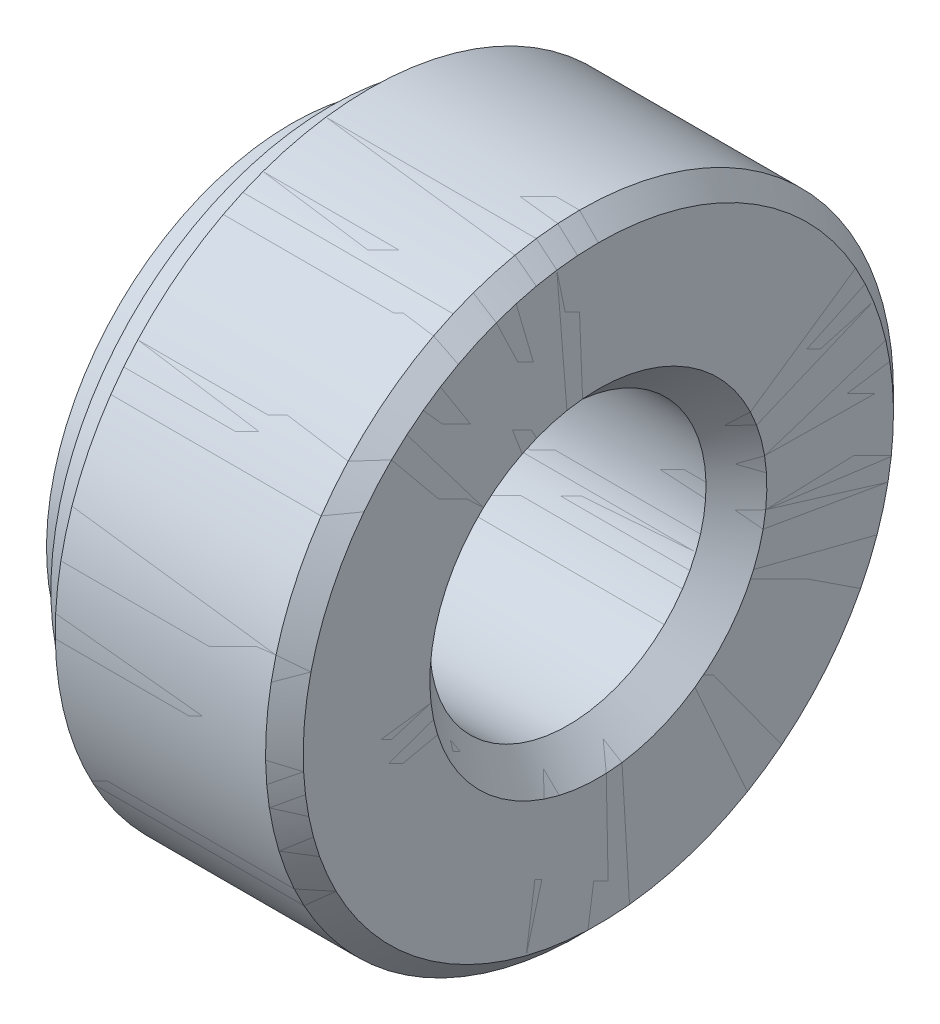
ISO-10303-21;
HEADER;
FILE_DESCRIPTION(('STEP AP214'),'2;1');
FILE_NAME('part.step','',(''),(''),'','','');
FILE_SCHEMA(('AUTOMOTIVE_DESIGN { 1 0 10303 214 1 1 1 1 }'));
ENDSEC;
DATA;
#1=APPLICATION_CONTEXT('core data for automotive mechanical design processes');
#2=APPLICATION_PROTOCOL_DEFINITION('international standard','automotive_design',2000,#1);
#3=PRODUCT_CONTEXT('',#1,'mechanical');
#4=PRODUCT('Part','Part','',(#3));
#5=PRODUCT_RELATED_PRODUCT_CATEGORY('part','',(#4));
#6=PRODUCT_DEFINITION_FORMATION('','',#4);
#7=PRODUCT_DEFINITION_CONTEXT('part definition',#1,'design');
#8=PRODUCT_DEFINITION('design','',#6,#7);
#9=PRODUCT_DEFINITION_SHAPE('','',#8);
#10=(LENGTH_UNIT() NAMED_UNIT(*) SI_UNIT(.MILLI.,.METRE.));
#11=(NAMED_UNIT(*) PLANE_ANGLE_UNIT() SI_UNIT($,.RADIAN.));
#12=(NAMED_UNIT(*) SI_UNIT($,.STERADIAN.) SOLID_ANGLE_UNIT());
#13=UNCERTAINTY_MEASURE_WITH_UNIT(LENGTH_MEASURE(1.E-05),#10,'distance_accuracy_value','');
#14=(GEOMETRIC_REPRESENTATION_CONTEXT(3) GLOBAL_UNCERTAINTY_ASSIGNED_CONTEXT((#13)) GLOBAL_UNIT_ASSIGNED_CONTEXT((#10,
#11,#12)) REPRESENTATION_CONTEXT('',''));
#15=CARTESIAN_POINT('',(0.,0.,0.));
#16=DIRECTION('',(0.,0.,1.));
#17=DIRECTION('',(1.,0.,0.));
#18=AXIS2_PLACEMENT_3D('',#15,#16,#17);
#19=CARTESIAN_POINT('',(5.1246,0.,0.));
#20=DIRECTION('',(-1.,0.,0.));
#21=DIRECTION('',(0.,-1.,0.));
#22=AXIS2_PLACEMENT_3D('',#19,#20,#21);
#23=CONICAL_SURFACE('',#22,5.59000000008528,0.785398163397448);
#24=CARTESIAN_POINT('',(5.46000000008462,0.,0.));
#25=DIRECTION('',(1.,0.,0.));
#26=DIRECTION('',(0.,1.,0.));
#27=AXIS2_PLACEMENT_3D('',#24,#25,#26);
#28=CIRCLE('',#27,5.25460000000066);
#29=CARTESIAN_POINT('',(5.46000000008462,5.25460000000066,0.));
#30=VERTEX_POINT('',#29);
#31=EDGE_CURVE('E11',#30,#30,#28,.T.);
#32=ORIENTED_EDGE('',*,*,#31,.F.);
#33=EDGE_LOOP('',(#32));
#34=FACE_BOUND('',#33,.T.);
#35=CARTESIAN_POINT('',(5.1246,0.,0.));
#36=DIRECTION('',(1.,0.,0.));
#37=DIRECTION('',(0.,1.,0.));
#38=AXIS2_PLACEMENT_3D('',#35,#36,#37);
#39=CIRCLE('',#38,5.59000000008528);
#40=CARTESIAN_POINT('',(5.1246,5.59000000008528,0.));
#41=VERTEX_POINT('',#40);
#42=EDGE_CURVE('E79',#41,#41,#39,.T.);
#43=ORIENTED_EDGE('',*,*,#42,.T.);
#44=EDGE_LOOP('',(#43));
#45=FACE_BOUND('',#44,.T.);
#46=ADVANCED_FACE('F39',(#34,#45),#23,.T.);
#47=CARTESIAN_POINT('',(5.46000000008462,-5.25460000000066,0.));
#48=DIRECTION('',(-1.,0.,0.));
#49=DIRECTION('',(0.,-1.,0.));
#50=AXIS2_PLACEMENT_3D('',#47,#48,#49);
#51=PLANE('',#50);
#52=CARTESIAN_POINT('',(5.46000000008462,0.,0.));
#53=DIRECTION('',(1.,0.,0.));
#54=DIRECTION('',(0.,1.,0.));
#55=AXIS2_PLACEMENT_3D('',#52,#53,#54);
#56=CIRCLE('',#55,3.0000000002813);
#57=CARTESIAN_POINT('',(5.46000000008462,3.0000000002813,0.));
#58=VERTEX_POINT('',#57);
#59=EDGE_CURVE('E45',#58,#58,#56,.T.);
#60=ORIENTED_EDGE('',*,*,#59,.F.);
#61=EDGE_LOOP('',(#60));
#62=FACE_BOUND('',#61,.T.);
#63=ORIENTED_EDGE('',*,*,#31,.T.);
#64=EDGE_LOOP('',(#63));
#65=FACE_BOUND('',#64,.T.);
#66=ADVANCED_FACE('F140',(#62,#65),#51,.F.);
#67=CARTESIAN_POINT('',(5.46000000008462,0.,0.));
#68=DIRECTION('',(1.,0.,0.));
#69=DIRECTION('',(0.,1.,0.));
#70=AXIS2_PLACEMENT_3D('',#67,#68,#69);
#71=CONICAL_SURFACE('',#70,3.0000000002813,0.78539816339745);
#72=CARTESIAN_POINT('',(4.91849999988153,0.,0.));
#73=DIRECTION('',(1.,0.,0.));
#74=DIRECTION('',(0.,1.,0.));
#75=AXIS2_PLACEMENT_3D('',#72,#73,#74);
#76=CIRCLE('',#75,2.45850000007822);
#77=CARTESIAN_POINT('',(4.91849999988153,2.45850000007822,0.));
#78=VERTEX_POINT('',#77);
#79=EDGE_CURVE('E49',#78,#78,#76,.T.);
#80=ORIENTED_EDGE('',*,*,#79,.F.);
#81=EDGE_LOOP('',(#80));
#82=FACE_BOUND('',#81,.T.);
#83=ORIENTED_EDGE('',*,*,#59,.T.);
#84=EDGE_LOOP('',(#83));
#85=FACE_BOUND('',#84,.T.);
#86=ADVANCED_FACE('F135',(#82,#85),#71,.F.);
#87=CARTESIAN_POINT('',(5.46000000008462,0.,0.));
#88=DIRECTION('',(1.,0.,0.));
#89=DIRECTION('',(0.,1.,0.));
#90=AXIS2_PLACEMENT_3D('',#87,#88,#89);
#91=CYLINDRICAL_SURFACE('',#90,2.45850000007822);
#92=CARTESIAN_POINT('',(0.54149999996453,0.,0.));
#93=DIRECTION('',(1.,0.,0.));
#94=DIRECTION('',(0.,1.,0.));
#95=AXIS2_PLACEMENT_3D('',#92,#93,#94);
#96=CIRCLE('',#95,2.45850000007822);
#97=CARTESIAN_POINT('',(0.54149999996453,2.45850000007822,0.));
#98=VERTEX_POINT('',#97);
#99=EDGE_CURVE('E53',#98,#98,#96,.T.);
#100=ORIENTED_EDGE('',*,*,#99,.F.);
#101=EDGE_LOOP('',(#100));
#102=FACE_BOUND('',#101,.T.);
#103=ORIENTED_EDGE('',*,*,#79,.T.);
#104=EDGE_LOOP('',(#103));
#105=FACE_BOUND('',#104,.T.);
#106=ADVANCED_FACE('F129',(#102,#105),#91,.F.);
#107=CARTESIAN_POINT('',(0.54149999996453,0.,0.));
#108=DIRECTION('',(-1.,0.,0.));
#109=DIRECTION('',(0.,-1.,0.));
#110=AXIS2_PLACEMENT_3D('',#107,#108,#109);
#111=CONICAL_SURFACE('',#110,2.45850000007822,0.785398163397449);
#112=CARTESIAN_POINT('',(0.,0.,0.));
#113=DIRECTION('',(1.,0.,0.));
#114=DIRECTION('',(0.,1.,0.));
#115=AXIS2_PLACEMENT_3D('',#112,#113,#114);
#116=CIRCLE('',#115,3.00000000004275);
#117=CARTESIAN_POINT('',(0.,3.00000000004275,0.));
#118=VERTEX_POINT('',#117);
#119=EDGE_CURVE('E58',#118,#118,#116,.T.);
#120=ORIENTED_EDGE('',*,*,#119,.F.);
#121=EDGE_LOOP('',(#120));
#122=FACE_BOUND('',#121,.T.);
#123=ORIENTED_EDGE('',*,*,#99,.T.);
#124=EDGE_LOOP('',(#123));
#125=FACE_BOUND('',#124,.T.);
#126=ADVANCED_FACE('F123',(#122,#125),#111,.F.);
#127=CARTESIAN_POINT('',(0.,-3.00000000004275,0.));
#128=DIRECTION('',(1.,0.,0.));
#129=DIRECTION('',(0.,1.,0.));
#130=AXIS2_PLACEMENT_3D('',#127,#128,#129);
#131=PLANE('',#130);
#132=CARTESIAN_POINT('',(0.,0.,0.));
#133=DIRECTION('',(1.,0.,0.));
#134=DIRECTION('',(0.,1.,0.));
#135=AXIS2_PLACEMENT_3D('',#132,#133,#134);
#136=CIRCLE('',#135,4.365);
#137=CARTESIAN_POINT('',(0.,4.365,0.));
#138=VERTEX_POINT('',#137);
#139=EDGE_CURVE('E61',#138,#138,#136,.T.);
#140=ORIENTED_EDGE('',*,*,#139,.F.);
#141=EDGE_LOOP('',(#140));
#142=FACE_BOUND('',#141,.T.);
#143=ORIENTED_EDGE('',*,*,#119,.T.);
#144=EDGE_LOOP('',(#143));
#145=FACE_BOUND('',#144,.T.);
#146=ADVANCED_FACE('F117',(#142,#145),#131,.F.);
#147=CARTESIAN_POINT('',(5.46000000008462,0.,0.));
#148=DIRECTION('',(1.,0.,0.));
#149=DIRECTION('',(0.,1.,0.));
#150=AXIS2_PLACEMENT_3D('',#147,#148,#149);
#151=CYLINDRICAL_SURFACE('',#150,4.365);
#152=CARTESIAN_POINT('',(0.318461538463854,0.,0.));
#153=DIRECTION('',(1.,0.,0.));
#154=DIRECTION('',(0.,1.,0.));
#155=AXIS2_PLACEMENT_3D('',#152,#153,#154);
#156=CIRCLE('',#155,4.365);
#157=CARTESIAN_POINT('',(0.318461538463853,4.365,0.));
#158=VERTEX_POINT('',#157);
#159=EDGE_CURVE('E64',#158,#158,#156,.T.);
#160=ORIENTED_EDGE('',*,*,#159,.F.);
#161=EDGE_LOOP('',(#160));
#162=FACE_BOUND('',#161,.T.);
#163=ORIENTED_EDGE('',*,*,#139,.T.);
#164=EDGE_LOOP('',(#163));
#165=FACE_BOUND('',#164,.T.);
#166=ADVANCED_FACE('F111',(#162,#165),#151,.T.);
#167=CARTESIAN_POINT('',(0.318461538463854,0.,0.));
#168=DIRECTION('',(-1.,0.,0.));
#169=DIRECTION('',(0.,-1.,0.));
#170=AXIS2_PLACEMENT_3D('',#167,#168,#169);
#171=CONICAL_SURFACE('',#170,4.365,0.1933610340518);
#172=CARTESIAN_POINT('',(0.690000000000001,0.,0.));
#173=DIRECTION('',(1.,0.,0.));
#174=DIRECTION('',(0.,1.,0.));
#175=AXIS2_PLACEMENT_3D('',#172,#173,#174);
#176=CIRCLE('',#175,4.29225000000291);
#177=CARTESIAN_POINT('',(0.69,4.29225000000291,0.));
#178=VERTEX_POINT('',#177);
#179=EDGE_CURVE('E67',#178,#178,#176,.T.);
#180=ORIENTED_EDGE('',*,*,#179,.F.);
#181=EDGE_LOOP('',(#180));
#182=FACE_BOUND('',#181,.T.);
#183=ORIENTED_EDGE('',*,*,#159,.T.);
#184=EDGE_LOOP('',(#183));
#185=FACE_BOUND('',#184,.T.);
#186=ADVANCED_FACE('F105',(#182,#185),#171,.T.);
#187=CARTESIAN_POINT('',(0.690000000000002,-4.29225000000291,0.));
#188=DIRECTION('',(1.,0.,0.));
#189=DIRECTION('',(0.,1.,0.));
#190=AXIS2_PLACEMENT_3D('',#187,#188,#189);
#191=PLANE('',#190);
#192=CARTESIAN_POINT('',(0.690000000000001,0.,0.));
#193=DIRECTION('',(1.,0.,0.));
#194=DIRECTION('',(0.,1.,0.));
#195=AXIS2_PLACEMENT_3D('',#192,#193,#194);
#196=CIRCLE('',#195,4.9775);
#197=CARTESIAN_POINT('',(0.69,4.9775,0.));
#198=VERTEX_POINT('',#197);
#199=EDGE_CURVE('E70',#198,#198,#196,.T.);
#200=ORIENTED_EDGE('',*,*,#199,.F.);
#201=EDGE_LOOP('',(#200));
#202=FACE_BOUND('',#201,.T.);
#203=ORIENTED_EDGE('',*,*,#179,.T.);
#204=EDGE_LOOP('',(#203));
#205=FACE_BOUND('',#204,.T.);
#206=ADVANCED_FACE('F99',(#202,#205),#191,.F.);
#207=CARTESIAN_POINT('',(5.46000000008462,0.,0.));
#208=DIRECTION('',(1.,0.,0.));
#209=DIRECTION('',(0.,1.,0.));
#210=AXIS2_PLACEMENT_3D('',#207,#208,#209);
#211=CYLINDRICAL_SURFACE('',#210,4.9775);
#212=CARTESIAN_POINT('',(1.38,0.,0.));
#213=DIRECTION('',(1.,0.,0.));
#214=DIRECTION('',(0.,1.,0.));
#215=AXIS2_PLACEMENT_3D('',#212,#213,#214);
#216=CIRCLE('',#215,4.9775);
#217=CARTESIAN_POINT('',(1.38,4.9775,0.));
#218=VERTEX_POINT('',#217);
#219=EDGE_CURVE('E73',#218,#218,#216,.T.);
#220=ORIENTED_EDGE('',*,*,#219,.F.);
#221=EDGE_LOOP('',(#220));
#222=FACE_BOUND('',#221,.T.);
#223=ORIENTED_EDGE('',*,*,#199,.T.);
#224=EDGE_LOOP('',(#223));
#225=FACE_BOUND('',#224,.T.);
#226=ADVANCED_FACE('F93',(#222,#225),#211,.T.);
#227=CARTESIAN_POINT('',(1.38,-4.9775,0.));
#228=DIRECTION('',(1.,0.,0.));
#229=DIRECTION('',(0.,1.,0.));
#230=AXIS2_PLACEMENT_3D('',#227,#228,#229);
#231=PLANE('',#230);
#232=CARTESIAN_POINT('',(1.38,0.,0.));
#233=DIRECTION('',(1.,0.,0.));
#234=DIRECTION('',(0.,1.,0.));
#235=AXIS2_PLACEMENT_3D('',#232,#233,#234);
#236=CIRCLE('',#235,5.59000000008528);
#237=CARTESIAN_POINT('',(1.38,5.59000000008528,0.));
#238=VERTEX_POINT('',#237);
#239=EDGE_CURVE('E76',#238,#238,#236,.T.);
#240=ORIENTED_EDGE('',*,*,#239,.F.);
#241=EDGE_LOOP('',(#240));
#242=FACE_BOUND('',#241,.T.);
#243=ORIENTED_EDGE('',*,*,#219,.T.);
#244=EDGE_LOOP('',(#243));
#245=FACE_BOUND('',#244,.T.);
#246=ADVANCED_FACE('F87',(#242,#245),#231,.F.);
#247=CARTESIAN_POINT('',(5.46000000008462,0.,0.));
#248=DIRECTION('',(1.,0.,0.));
#249=DIRECTION('',(0.,1.,0.));
#250=AXIS2_PLACEMENT_3D('',#247,#248,#249);
#251=CYLINDRICAL_SURFACE('',#250,5.59000000008528);
#252=ORIENTED_EDGE('',*,*,#42,.F.);
#253=EDGE_LOOP('',(#252));
#254=FACE_BOUND('',#253,.T.);
#255=ORIENTED_EDGE('',*,*,#239,.T.);
#256=EDGE_LOOP('',(#255));
#257=FACE_BOUND('',#256,.T.);
#258=ADVANCED_FACE('F84',(#254,#257),#251,.T.);
#259=CLOSED_SHELL('',(#46,#66,#86,#106,#126,#146,#166,#186,#206,#226,#246,#258));
#260=MANIFOLD_SOLID_BREP('B2',#259);
#261=CARTESIAN_POINT('',(5.46000000008462,5.25460000000066,0.));
#262=DIRECTION('',(1.,0.,0.));
#263=DIRECTION('',(0.,1.,0.));
#264=AXIS2_PLACEMENT_3D('',#261,#262,#263);
#265=PLANE('',#264);
#266=CARTESIAN_POINT('',(5.46000000008462,0.,0.));
#267=DIRECTION('',(1.,0.,0.));
#268=DIRECTION('',(0.,1.,0.));
#269=AXIS2_PLACEMENT_3D('',#266,#267,#268);
#270=CIRCLE('',#269,5.25460000000066);
#271=CARTESIAN_POINT('',(5.46000000008462,5.25460000000066,0.));
#272=VERTEX_POINT('',#271);
#273=EDGE_CURVE('E261',#272,#272,#270,.T.);
#274=ORIENTED_EDGE('',*,*,#273,.T.);
#275=EDGE_LOOP('',(#274));
#276=FACE_BOUND('',#275,.T.);
#277=CARTESIAN_POINT('',(5.46000000008462,0.,0.));
#278=DIRECTION('',(1.,0.,0.));
#279=DIRECTION('',(0.,1.,0.));
#280=AXIS2_PLACEMENT_3D('',#277,#278,#279);
#281=CIRCLE('',#280,3.0000000002813);
#282=CARTESIAN_POINT('',(5.46000000008462,3.0000000002813,0.));
#283=VERTEX_POINT('',#282);
#284=EDGE_CURVE('E38',#283,#283,#281,.T.);
#285=ORIENTED_EDGE('',*,*,#284,.F.);
#286=EDGE_LOOP('',(#285));
#287=FACE_BOUND('',#286,.T.);
#288=ADVANCED_FACE('F221',(#276,#287),#265,.T.);
#289=CARTESIAN_POINT('',(4.91849999988153,0.,0.));
#290=DIRECTION('',(1.,0.,0.));
#291=DIRECTION('',(0.,1.,0.));
#292=AXIS2_PLACEMENT_3D('',#289,#290,#291);
#293=CONICAL_SURFACE('',#292,2.45850000007822,0.785398163397449);
#294=ORIENTED_EDGE('',*,*,#284,.T.);
#295=EDGE_LOOP('',(#294));
#296=FACE_BOUND('',#295,.T.);
#297=CARTESIAN_POINT('',(4.91849999988153,0.,0.));
#298=DIRECTION('',(1.,0.,0.));
#299=DIRECTION('',(0.,1.,0.));
#300=AXIS2_PLACEMENT_3D('',#297,#298,#299);
#301=CIRCLE('',#300,2.45850000007822);
#302=CARTESIAN_POINT('',(4.91849999988153,2.45850000007822,0.));
#303=VERTEX_POINT('',#302);
#304=EDGE_CURVE('E227',#303,#303,#301,.T.);
#305=ORIENTED_EDGE('',*,*,#304,.F.);
#306=EDGE_LOOP('',(#305));
#307=FACE_BOUND('',#306,.T.);
#308=ADVANCED_FACE('F279',(#296,#307),#293,.F.);
#309=CARTESIAN_POINT('',(5.46000000008462,0.,0.));
#310=DIRECTION('',(1.,0.,0.));
#311=DIRECTION('',(0.,1.,0.));
#312=AXIS2_PLACEMENT_3D('',#309,#310,#311);
#313=CYLINDRICAL_SURFACE('',#312,2.45850000007822);
#314=ORIENTED_EDGE('',*,*,#304,.T.);
#315=EDGE_LOOP('',(#314));
#316=FACE_BOUND('',#315,.T.);
#317=CARTESIAN_POINT('',(0.54149999996453,0.,0.));
#318=DIRECTION('',(1.,0.,0.));
#319=DIRECTION('',(0.,1.,0.));
#320=AXIS2_PLACEMENT_3D('',#317,#318,#319);
#321=CIRCLE('',#320,2.45850000007822);
#322=CARTESIAN_POINT('',(0.54149999996453,2.45850000007822,0.));
#323=VERTEX_POINT('',#322);
#324=EDGE_CURVE('E231',#323,#323,#321,.T.);
#325=ORIENTED_EDGE('',*,*,#324,.F.);
#326=EDGE_LOOP('',(#325));
#327=FACE_BOUND('',#326,.T.);
#328=ADVANCED_FACE('F283',(#316,#327),#313,.F.);
#329=CARTESIAN_POINT('',(0.,0.,0.));
#330=DIRECTION('',(-1.,0.,0.));
#331=DIRECTION('',(0.,-1.,0.));
#332=AXIS2_PLACEMENT_3D('',#329,#330,#331);
#333=CONICAL_SURFACE('',#332,3.00000000004275,0.785398163397449);
#334=ORIENTED_EDGE('',*,*,#324,.T.);
#335=EDGE_LOOP('',(#334));
#336=FACE_BOUND('',#335,.T.);
#337=CARTESIAN_POINT('',(0.,0.,0.));
#338=DIRECTION('',(1.,0.,0.));
#339=DIRECTION('',(0.,1.,0.));
#340=AXIS2_PLACEMENT_3D('',#337,#338,#339);
#341=CIRCLE('',#340,3.00000000004275);
#342=CARTESIAN_POINT('',(0.,3.00000000004275,0.));
#343=VERTEX_POINT('',#342);
#344=EDGE_CURVE('E235',#343,#343,#341,.T.);
#345=ORIENTED_EDGE('',*,*,#344,.F.);
#346=EDGE_LOOP('',(#345));
#347=FACE_BOUND('',#346,.T.);
#348=ADVANCED_FACE('F287',(#336,#347),#333,.F.);
#349=CARTESIAN_POINT('',(0.,3.00000000004275,0.));
#350=DIRECTION('',(-1.,0.,0.));
#351=DIRECTION('',(0.,-1.,0.));
#352=AXIS2_PLACEMENT_3D('',#349,#350,#351);
#353=PLANE('',#352);
#354=ORIENTED_EDGE('',*,*,#344,.T.);
#355=EDGE_LOOP('',(#354));
#356=FACE_BOUND('',#355,.T.);
#357=CARTESIAN_POINT('',(0.,0.,0.));
#358=DIRECTION('',(1.,0.,0.));
#359=DIRECTION('',(0.,1.,0.));
#360=AXIS2_PLACEMENT_3D('',#357,#358,#359);
#361=CIRCLE('',#360,4.365);
#362=CARTESIAN_POINT('',(0.,4.365,0.));
#363=VERTEX_POINT('',#362);
#364=EDGE_CURVE('E240',#363,#363,#361,.T.);
#365=ORIENTED_EDGE('',*,*,#364,.F.);
#366=EDGE_LOOP('',(#365));
#367=FACE_BOUND('',#366,.T.);
#368=ADVANCED_FACE('F293',(#356,#367),#353,.T.);
#369=CARTESIAN_POINT('',(5.46000000008462,0.,0.));
#370=DIRECTION('',(1.,0.,0.));
#371=DIRECTION('',(0.,1.,0.));
#372=AXIS2_PLACEMENT_3D('',#369,#370,#371);
#373=CYLINDRICAL_SURFACE('',#372,4.365);
#374=ORIENTED_EDGE('',*,*,#364,.T.);
#375=EDGE_LOOP('',(#374));
#376=FACE_BOUND('',#375,.T.);
#377=CARTESIAN_POINT('',(0.318461538463854,0.,0.));
#378=DIRECTION('',(1.,0.,0.));
#379=DIRECTION('',(0.,1.,0.));
#380=AXIS2_PLACEMENT_3D('',#377,#378,#379);
#381=CIRCLE('',#380,4.365);
#382=CARTESIAN_POINT('',(0.318461538463853,4.365,0.));
#383=VERTEX_POINT('',#382);
#384=EDGE_CURVE('E243',#383,#383,#381,.T.);
#385=ORIENTED_EDGE('',*,*,#384,.F.);
#386=EDGE_LOOP('',(#385));
#387=FACE_BOUND('',#386,.T.);
#388=ADVANCED_FACE('F297',(#376,#387),#373,.T.);
#389=CARTESIAN_POINT('',(0.690000000000001,0.,0.));
#390=DIRECTION('',(-1.,0.,0.));
#391=DIRECTION('',(0.,-1.,0.));
#392=AXIS2_PLACEMENT_3D('',#389,#390,#391);
#393=CONICAL_SURFACE('',#392,4.29225000000291,0.1933610340518);
#394=ORIENTED_EDGE('',*,*,#384,.T.);
#395=EDGE_LOOP('',(#394));
#396=FACE_BOUND('',#395,.T.);
#397=CARTESIAN_POINT('',(0.690000000000001,0.,0.));
#398=DIRECTION('',(1.,0.,0.));
#399=DIRECTION('',(0.,1.,0.));
#400=AXIS2_PLACEMENT_3D('',#397,#398,#399);
#401=CIRCLE('',#400,4.29225000000291);
#402=CARTESIAN_POINT('',(0.69,4.29225000000291,0.));
#403=VERTEX_POINT('',#402);
#404=EDGE_CURVE('E246',#403,#403,#401,.T.);
#405=ORIENTED_EDGE('',*,*,#404,.F.);
#406=EDGE_LOOP('',(#405));
#407=FACE_BOUND('',#406,.T.);
#408=ADVANCED_FACE('F301',(#396,#407),#393,.T.);
#409=CARTESIAN_POINT('',(0.69,4.29225000000291,0.));
#410=DIRECTION('',(-1.,0.,0.));
#411=DIRECTION('',(0.,-1.,0.));
#412=AXIS2_PLACEMENT_3D('',#409,#410,#411);
#413=PLANE('',#412);
#414=ORIENTED_EDGE('',*,*,#404,.T.);
#415=EDGE_LOOP('',(#414));
#416=FACE_BOUND('',#415,.T.);
#417=CARTESIAN_POINT('',(0.690000000000001,0.,0.));
#418=DIRECTION('',(1.,0.,0.));
#419=DIRECTION('',(0.,1.,0.));
#420=AXIS2_PLACEMENT_3D('',#417,#418,#419);
#421=CIRCLE('',#420,4.9775);
#422=CARTESIAN_POINT('',(0.69,4.9775,0.));
#423=VERTEX_POINT('',#422);
#424=EDGE_CURVE('E249',#423,#423,#421,.T.);
#425=ORIENTED_EDGE('',*,*,#424,.F.);
#426=EDGE_LOOP('',(#425));
#427=FACE_BOUND('',#426,.T.);
#428=ADVANCED_FACE('F305',(#416,#427),#413,.T.);
#429=CARTESIAN_POINT('',(5.46000000008462,0.,0.));
#430=DIRECTION('',(1.,0.,0.));
#431=DIRECTION('',(0.,1.,0.));
#432=AXIS2_PLACEMENT_3D('',#429,#430,#431);
#433=CYLINDRICAL_SURFACE('',#432,4.9775);
#434=ORIENTED_EDGE('',*,*,#424,.T.);
#435=EDGE_LOOP('',(#434));
#436=FACE_BOUND('',#435,.T.);
#437=CARTESIAN_POINT('',(1.38,0.,0.));
#438=DIRECTION('',(1.,0.,0.));
#439=DIRECTION('',(0.,1.,0.));
#440=AXIS2_PLACEMENT_3D('',#437,#438,#439);
#441=CIRCLE('',#440,4.9775);
#442=CARTESIAN_POINT('',(1.38,4.9775,0.));
#443=VERTEX_POINT('',#442);
#444=EDGE_CURVE('E252',#443,#443,#441,.T.);
#445=ORIENTED_EDGE('',*,*,#444,.F.);
#446=EDGE_LOOP('',(#445));
#447=FACE_BOUND('',#446,.T.);
#448=ADVANCED_FACE('F309',(#436,#447),#433,.T.);
#449=CARTESIAN_POINT('',(1.38,4.9775,0.));
#450=DIRECTION('',(-1.,0.,0.));
#451=DIRECTION('',(0.,-1.,0.));
#452=AXIS2_PLACEMENT_3D('',#449,#450,#451);
#453=PLANE('',#452);
#454=ORIENTED_EDGE('',*,*,#444,.T.);
#455=EDGE_LOOP('',(#454));
#456=FACE_BOUND('',#455,.T.);
#457=CARTESIAN_POINT('',(1.38,0.,0.));
#458=DIRECTION('',(1.,0.,0.));
#459=DIRECTION('',(0.,1.,0.));
#460=AXIS2_PLACEMENT_3D('',#457,#458,#459);
#461=CIRCLE('',#460,5.59000000008528);
#462=CARTESIAN_POINT('',(1.38,5.59000000008528,0.));
#463=VERTEX_POINT('',#462);
#464=EDGE_CURVE('E255',#463,#463,#461,.T.);
#465=ORIENTED_EDGE('',*,*,#464,.F.);
#466=EDGE_LOOP('',(#465));
#467=FACE_BOUND('',#466,.T.);
#468=ADVANCED_FACE('F275',(#456,#467),#453,.T.);
#469=CARTESIAN_POINT('',(5.46000000008462,0.,0.));
#470=DIRECTION('',(1.,0.,0.));
#471=DIRECTION('',(0.,1.,0.));
#472=AXIS2_PLACEMENT_3D('',#469,#470,#471);
#473=CYLINDRICAL_SURFACE('',#472,5.59000000008528);
#474=ORIENTED_EDGE('',*,*,#464,.T.);
#475=EDGE_LOOP('',(#474));
#476=FACE_BOUND('',#475,.T.);
#477=CARTESIAN_POINT('',(5.1246,0.,0.));
#478=DIRECTION('',(1.,0.,0.));
#479=DIRECTION('',(0.,1.,0.));
#480=AXIS2_PLACEMENT_3D('',#477,#478,#479);
#481=CIRCLE('',#480,5.59000000008528);
#482=CARTESIAN_POINT('',(5.1246,5.59000000008528,0.));
#483=VERTEX_POINT('',#482);
#484=EDGE_CURVE('E258',#483,#483,#481,.T.);
#485=ORIENTED_EDGE('',*,*,#484,.F.);
#486=EDGE_LOOP('',(#485));
#487=FACE_BOUND('',#486,.T.);
#488=ADVANCED_FACE('F269',(#476,#487),#473,.T.);
#489=CARTESIAN_POINT('',(5.46000000008462,0.,0.));
#490=DIRECTION('',(-1.,0.,0.));
#491=DIRECTION('',(0.,-1.,0.));
#492=AXIS2_PLACEMENT_3D('',#489,#490,#491);
#493=CONICAL_SURFACE('',#492,5.25460000000066,0.785398163397448);
#494=ORIENTED_EDGE('',*,*,#484,.T.);
#495=EDGE_LOOP('',(#494));
#496=FACE_BOUND('',#495,.T.);
#497=ORIENTED_EDGE('',*,*,#273,.F.);
#498=EDGE_LOOP('',(#497));
#499=FACE_BOUND('',#498,.T.);
#500=ADVANCED_FACE('F267',(#496,#499),#493,.T.);
#501=CLOSED_SHELL('',(#288,#308,#328,#348,#368,#388,#408,#428,#448,#468,#488,#500));
#502=MANIFOLD_SOLID_BREP('B6',#501);
#503=ADVANCED_BREP_SHAPE_REPRESENTATION('',(#18,#260,#502),#14);
#504=SHAPE_DEFINITION_REPRESENTATION(#9,#503);
ENDSEC;
END-ISO-10303-21;
